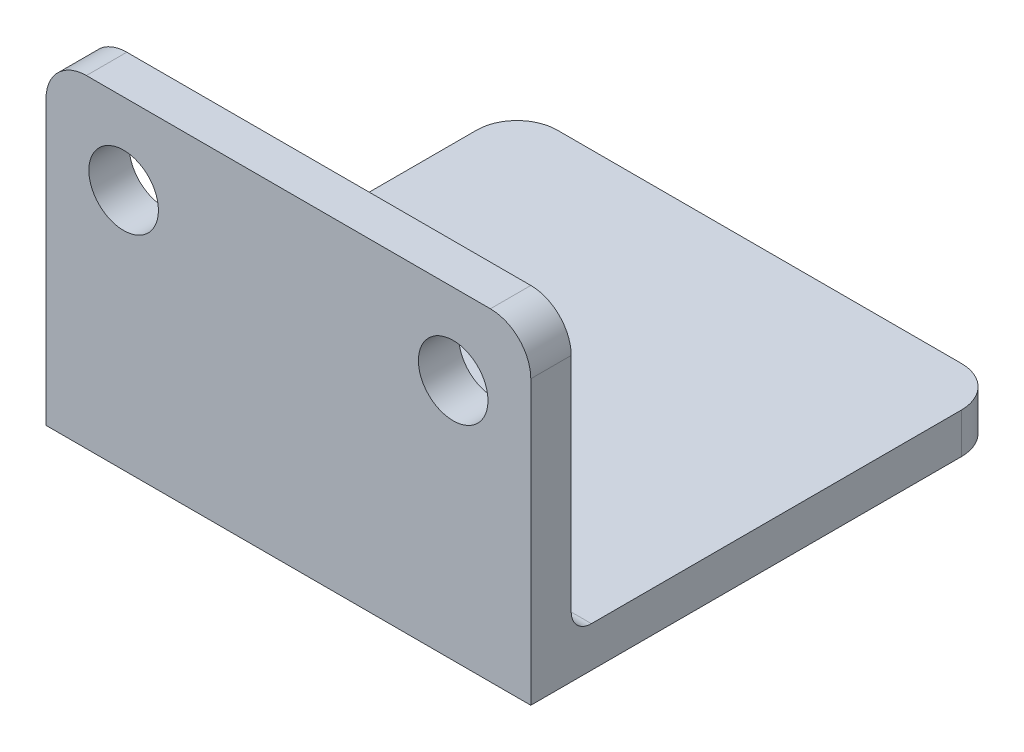
ISO-10303-21;
HEADER;
FILE_DESCRIPTION(('STEP AP214'),'2;1');
FILE_NAME('part.step','',(''),(''),'','','');
FILE_SCHEMA(('AUTOMOTIVE_DESIGN { 1 0 10303 214 1 1 1 1 }'));
ENDSEC;
DATA;
#1=APPLICATION_CONTEXT('core data for automotive mechanical design processes');
#2=APPLICATION_PROTOCOL_DEFINITION('international standard','automotive_design',2000,#1);
#3=PRODUCT_CONTEXT('',#1,'mechanical');
#4=PRODUCT('Part','Part','',(#3));
#5=PRODUCT_RELATED_PRODUCT_CATEGORY('part','',(#4));
#6=PRODUCT_DEFINITION_FORMATION('','',#4);
#7=PRODUCT_DEFINITION_CONTEXT('part definition',#1,'design');
#8=PRODUCT_DEFINITION('design','',#6,#7);
#9=PRODUCT_DEFINITION_SHAPE('','',#8);
#10=(LENGTH_UNIT() NAMED_UNIT(*) SI_UNIT(.MILLI.,.METRE.));
#11=(NAMED_UNIT(*) PLANE_ANGLE_UNIT() SI_UNIT($,.RADIAN.));
#12=(NAMED_UNIT(*) SI_UNIT($,.STERADIAN.) SOLID_ANGLE_UNIT());
#13=UNCERTAINTY_MEASURE_WITH_UNIT(LENGTH_MEASURE(1.E-05),#10,'distance_accuracy_value','');
#14=(GEOMETRIC_REPRESENTATION_CONTEXT(3) GLOBAL_UNCERTAINTY_ASSIGNED_CONTEXT((#13)) GLOBAL_UNIT_ASSIGNED_CONTEXT((#10,
#11,#12)) REPRESENTATION_CONTEXT('',''));
#15=CARTESIAN_POINT('',(0.,0.,0.));
#16=DIRECTION('',(0.,0.,1.));
#17=DIRECTION('',(1.,0.,0.));
#18=AXIS2_PLACEMENT_3D('',#15,#16,#17);
#19=CARTESIAN_POINT('',(76.2,0.,-6.35));
#20=DIRECTION('',(0.,0.,1.));
#21=DIRECTION('',(1.,0.,0.));
#22=AXIS2_PLACEMENT_3D('',#19,#20,#21);
#23=PLANE('',#22);
#24=CARTESIAN_POINT('',(63.9981454823114,38.1,-6.35000000000001));
#25=DIRECTION('',(0.,0.,1.));
#26=DIRECTION('',(1.,0.,0.));
#27=AXIS2_PLACEMENT_3D('',#24,#25,#26);
#28=CIRCLE('',#27,5.47023534939912);
#29=CARTESIAN_POINT('',(69.4683808317105,38.1,-6.35000000000002));
#30=VERTEX_POINT('',#29);
#31=EDGE_CURVE('E275',#30,#30,#28,.T.);
#32=ORIENTED_EDGE('',*,*,#31,.T.);
#33=EDGE_LOOP('',(#32));
#34=FACE_BOUND('',#33,.T.);
#35=CARTESIAN_POINT('',(12.2018545176886,38.1,-6.35000000000001));
#36=DIRECTION('',(0.,0.,1.));
#37=DIRECTION('',(1.,0.,0.));
#38=AXIS2_PLACEMENT_3D('',#35,#36,#37);
#39=CIRCLE('',#38,5.4702353493991);
#40=CARTESIAN_POINT('',(17.6720898670877,38.1,-6.35000000000002));
#41=VERTEX_POINT('',#40);
#42=EDGE_CURVE('E153',#41,#41,#39,.T.);
#43=ORIENTED_EDGE('',*,*,#42,.T.);
#44=EDGE_LOOP('',(#43));
#45=FACE_BOUND('',#44,.T.);
#46=DIRECTION('',(0.,1.,0.));
#47=VECTOR('',#46,1.);
#48=CARTESIAN_POINT('',(76.2,0.,-6.35));
#49=LINE('',#48,#47);
#50=CARTESIAN_POINT('',(76.2,9.525,-6.35));
#51=VERTEX_POINT('',#50);
#52=CARTESIAN_POINT('',(76.2,44.45,-6.35));
#53=VERTEX_POINT('',#52);
#54=EDGE_CURVE('E143',#51,#53,#49,.T.);
#55=ORIENTED_EDGE('',*,*,#54,.F.);
#56=DIRECTION('',(-1.,0.,0.));
#57=VECTOR('',#56,1.);
#58=CARTESIAN_POINT('',(0.,9.525,-6.35));
#59=LINE('',#58,#57);
#60=CARTESIAN_POINT('',(0.,9.525,-6.35));
#61=VERTEX_POINT('',#60);
#62=EDGE_CURVE('E201',#51,#61,#59,.T.);
#63=ORIENTED_EDGE('',*,*,#62,.T.);
#64=DIRECTION('',(0.,1.,0.));
#65=VECTOR('',#64,1.);
#66=CARTESIAN_POINT('',(0.,0.,-6.35));
#67=LINE('',#66,#65);
#68=CARTESIAN_POINT('',(0.,44.45,-6.35));
#69=VERTEX_POINT('',#68);
#70=EDGE_CURVE('E151',#61,#69,#67,.T.);
#71=ORIENTED_EDGE('',*,*,#70,.T.);
#72=CARTESIAN_POINT('',(6.35,44.45,-6.35));
#73=DIRECTION('',(0.,0.,1.));
#74=DIRECTION('',(1.,0.,0.));
#75=AXIS2_PLACEMENT_3D('',#72,#73,#74);
#76=CIRCLE('',#75,6.35);
#77=CARTESIAN_POINT('',(6.35000000000002,50.8,-6.35));
#78=VERTEX_POINT('',#77);
#79=EDGE_CURVE('E175',#69,#78,#76,.F.);
#80=ORIENTED_EDGE('',*,*,#79,.T.);
#81=DIRECTION('',(-1.,0.,0.));
#82=VECTOR('',#81,1.);
#83=CARTESIAN_POINT('',(76.2,50.8,-6.35));
#84=LINE('',#83,#82);
#85=CARTESIAN_POINT('',(69.85,50.8,-6.35));
#86=VERTEX_POINT('',#85);
#87=EDGE_CURVE('E163',#86,#78,#84,.T.);
#88=ORIENTED_EDGE('',*,*,#87,.F.);
#89=CARTESIAN_POINT('',(69.85,44.45,-6.35));
#90=DIRECTION('',(0.,0.,1.));
#91=DIRECTION('',(1.,0.,0.));
#92=AXIS2_PLACEMENT_3D('',#89,#90,#91);
#93=CIRCLE('',#92,6.35);
#94=EDGE_CURVE('E172',#86,#53,#93,.F.);
#95=ORIENTED_EDGE('',*,*,#94,.T.);
#96=EDGE_LOOP('',(#55,#63,#71,#80,#88,#95));
#97=FACE_BOUND('',#96,.T.);
#98=ADVANCED_FACE('F33',(#34,#45,#97),#23,.F.);
#99=CARTESIAN_POINT('',(76.2,50.8,0.));
#100=DIRECTION('',(0.,1.,0.));
#101=DIRECTION('',(0.,0.,1.));
#102=AXIS2_PLACEMENT_3D('',#99,#100,#101);
#103=PLANE('',#102);
#104=ORIENTED_EDGE('',*,*,#87,.T.);
#105=DIRECTION('',(0.,0.,-1.));
#106=VECTOR('',#105,1.);
#107=CARTESIAN_POINT('',(6.34999999999999,50.8,0.));
#108=LINE('',#107,#106);
#109=CARTESIAN_POINT('',(6.35000000000002,50.8,0.));
#110=VERTEX_POINT('',#109);
#111=EDGE_CURVE('E180',#78,#110,#108,.F.);
#112=ORIENTED_EDGE('',*,*,#111,.T.);
#113=DIRECTION('',(-1.,0.,0.));
#114=VECTOR('',#113,1.);
#115=CARTESIAN_POINT('',(76.2,50.8,0.));
#116=LINE('',#115,#114);
#117=CARTESIAN_POINT('',(69.85,50.8,0.));
#118=VERTEX_POINT('',#117);
#119=EDGE_CURVE('E137',#118,#110,#116,.T.);
#120=ORIENTED_EDGE('',*,*,#119,.F.);
#121=DIRECTION('',(0.,0.,-1.));
#122=VECTOR('',#121,1.);
#123=CARTESIAN_POINT('',(69.85,50.8,-6.35));
#124=LINE('',#123,#122);
#125=EDGE_CURVE('E177',#118,#86,#124,.T.);
#126=ORIENTED_EDGE('',*,*,#125,.T.);
#127=EDGE_LOOP('',(#104,#112,#120,#126));
#128=FACE_BOUND('',#127,.T.);
#129=ADVANCED_FACE('F218',(#128),#103,.T.);
#130=CARTESIAN_POINT('',(76.2,0.,0.));
#131=DIRECTION('',(0.,0.,1.));
#132=DIRECTION('',(1.,0.,0.));
#133=AXIS2_PLACEMENT_3D('',#130,#131,#132);
#134=PLANE('',#133);
#135=CARTESIAN_POINT('',(63.9981454823114,38.1,0.));
#136=DIRECTION('',(0.,0.,1.));
#137=DIRECTION('',(-1.,0.,0.));
#138=AXIS2_PLACEMENT_3D('',#135,#136,#137);
#139=CIRCLE('',#138,5.47023534939912);
#140=CARTESIAN_POINT('',(69.4683808317105,38.1,0.));
#141=VERTEX_POINT('',#140);
#142=EDGE_CURVE('E273',#141,#141,#139,.T.);
#143=ORIENTED_EDGE('',*,*,#142,.F.);
#144=EDGE_LOOP('',(#143));
#145=FACE_BOUND('',#144,.T.);
#146=CARTESIAN_POINT('',(12.2018545176886,38.1,0.));
#147=DIRECTION('',(0.,0.,1.));
#148=DIRECTION('',(1.,0.,0.));
#149=AXIS2_PLACEMENT_3D('',#146,#147,#148);
#150=CIRCLE('',#149,5.4702353493991);
#151=CARTESIAN_POINT('',(17.6720898670877,38.1,0.));
#152=VERTEX_POINT('',#151);
#153=EDGE_CURVE('E276',#152,#152,#150,.T.);
#154=ORIENTED_EDGE('',*,*,#153,.F.);
#155=EDGE_LOOP('',(#154));
#156=FACE_BOUND('',#155,.T.);
#157=ORIENTED_EDGE('',*,*,#119,.T.);
#158=CARTESIAN_POINT('',(6.35,44.45,0.));
#159=DIRECTION('',(0.,0.,1.));
#160=DIRECTION('',(1.,0.,0.));
#161=AXIS2_PLACEMENT_3D('',#158,#159,#160);
#162=CIRCLE('',#161,6.35);
#163=CARTESIAN_POINT('',(0.,44.45,0.));
#164=VERTEX_POINT('',#163);
#165=EDGE_CURVE('E184',#110,#164,#162,.T.);
#166=ORIENTED_EDGE('',*,*,#165,.T.);
#167=DIRECTION('',(0.,1.,0.));
#168=VECTOR('',#167,1.);
#169=CARTESIAN_POINT('',(0.,0.,0.));
#170=LINE('',#169,#168);
#171=CARTESIAN_POINT('',(0.,0.,0.));
#172=VERTEX_POINT('',#171);
#173=EDGE_CURVE('E136',#172,#164,#170,.T.);
#174=ORIENTED_EDGE('',*,*,#173,.F.);
#175=DIRECTION('',(-1.,0.,0.));
#176=VECTOR('',#175,1.);
#177=CARTESIAN_POINT('',(76.2,0.,0.));
#178=LINE('',#177,#176);
#179=CARTESIAN_POINT('',(76.2,0.,0.));
#180=VERTEX_POINT('',#179);
#181=EDGE_CURVE('E120',#180,#172,#178,.T.);
#182=ORIENTED_EDGE('',*,*,#181,.F.);
#183=DIRECTION('',(0.,1.,0.));
#184=VECTOR('',#183,1.);
#185=CARTESIAN_POINT('',(76.2,0.,0.));
#186=LINE('',#185,#184);
#187=CARTESIAN_POINT('',(76.2,44.45,0.));
#188=VERTEX_POINT('',#187);
#189=EDGE_CURVE('E128',#180,#188,#186,.T.);
#190=ORIENTED_EDGE('',*,*,#189,.T.);
#191=CARTESIAN_POINT('',(69.85,44.45,0.));
#192=DIRECTION('',(0.,0.,1.));
#193=DIRECTION('',(1.,0.,0.));
#194=AXIS2_PLACEMENT_3D('',#191,#192,#193);
#195=CIRCLE('',#194,6.35);
#196=EDGE_CURVE('E182',#188,#118,#195,.T.);
#197=ORIENTED_EDGE('',*,*,#196,.T.);
#198=EDGE_LOOP('',(#157,#166,#174,#182,#190,#197));
#199=FACE_BOUND('',#198,.T.);
#200=ADVANCED_FACE('F133',(#145,#156,#199),#134,.T.);
#201=CARTESIAN_POINT('',(76.2,0.,-74.0264919260767));
#202=DIRECTION('',(0.,-1.,0.));
#203=DIRECTION('',(0.,0.,-1.));
#204=AXIS2_PLACEMENT_3D('',#201,#202,#203);
#205=PLANE('',#204);
#206=DIRECTION('',(0.,0.,1.));
#207=VECTOR('',#206,1.);
#208=CARTESIAN_POINT('',(0.,0.,-74.0264919260767));
#209=LINE('',#208,#207);
#210=CARTESIAN_POINT('',(0.,0.,-67.6764919260767));
#211=VERTEX_POINT('',#210);
#212=EDGE_CURVE('E155',#211,#172,#209,.T.);
#213=ORIENTED_EDGE('',*,*,#212,.F.);
#214=CARTESIAN_POINT('',(6.35,0.,-67.6764919260767));
#215=DIRECTION('',(0.,-1.,0.));
#216=DIRECTION('',(0.,0.,-1.));
#217=AXIS2_PLACEMENT_3D('',#214,#215,#216);
#218=CIRCLE('',#217,6.35);
#219=CARTESIAN_POINT('',(6.35000000000002,0.,-74.0264919260767));
#220=VERTEX_POINT('',#219);
#221=EDGE_CURVE('E190',#211,#220,#218,.T.);
#222=ORIENTED_EDGE('',*,*,#221,.T.);
#223=DIRECTION('',(-1.,0.,0.));
#224=VECTOR('',#223,1.);
#225=CARTESIAN_POINT('',(76.2,0.,-74.0264919260767));
#226=LINE('',#225,#224);
#227=CARTESIAN_POINT('',(69.85,0.,-74.0264919260767));
#228=VERTEX_POINT('',#227);
#229=EDGE_CURVE('E138',#228,#220,#226,.T.);
#230=ORIENTED_EDGE('',*,*,#229,.F.);
#231=CARTESIAN_POINT('',(69.85,0.,-67.6764919260767));
#232=DIRECTION('',(0.,-1.,0.));
#233=DIRECTION('',(0.,0.,-1.));
#234=AXIS2_PLACEMENT_3D('',#231,#232,#233);
#235=CIRCLE('',#234,6.35);
#236=CARTESIAN_POINT('',(76.2,0.,-67.6764919260767));
#237=VERTEX_POINT('',#236);
#238=EDGE_CURVE('E123',#228,#237,#235,.T.);
#239=ORIENTED_EDGE('',*,*,#238,.T.);
#240=DIRECTION('',(0.,0.,1.));
#241=VECTOR('',#240,1.);
#242=CARTESIAN_POINT('',(76.2,0.,-74.0264919260767));
#243=LINE('',#242,#241);
#244=EDGE_CURVE('E116',#237,#180,#243,.T.);
#245=ORIENTED_EDGE('',*,*,#244,.T.);
#246=ORIENTED_EDGE('',*,*,#181,.T.);
#247=EDGE_LOOP('',(#213,#222,#230,#239,#245,#246));
#248=FACE_BOUND('',#247,.T.);
#249=ADVANCED_FACE('F119',(#248),#205,.T.);
#250=CARTESIAN_POINT('',(76.2,6.35,-74.0264919260767));
#251=DIRECTION('',(0.,0.,-1.));
#252=DIRECTION('',(-1.,0.,0.));
#253=AXIS2_PLACEMENT_3D('',#250,#251,#252);
#254=PLANE('',#253);
#255=ORIENTED_EDGE('',*,*,#229,.T.);
#256=DIRECTION('',(0.,-1.,0.));
#257=VECTOR('',#256,1.);
#258=CARTESIAN_POINT('',(6.34999999999999,6.35,-74.0264919260767));
#259=LINE('',#258,#257);
#260=CARTESIAN_POINT('',(6.35000000000002,6.35,-74.0264919260767));
#261=VERTEX_POINT('',#260);
#262=EDGE_CURVE('E195',#220,#261,#259,.F.);
#263=ORIENTED_EDGE('',*,*,#262,.T.);
#264=DIRECTION('',(-1.,0.,0.));
#265=VECTOR('',#264,1.);
#266=CARTESIAN_POINT('',(76.2,6.35,-74.0264919260767));
#267=LINE('',#266,#265);
#268=CARTESIAN_POINT('',(69.85,6.35,-74.0264919260767));
#269=VERTEX_POINT('',#268);
#270=EDGE_CURVE('E150',#269,#261,#267,.T.);
#271=ORIENTED_EDGE('',*,*,#270,.F.);
#272=DIRECTION('',(0.,-1.,0.));
#273=VECTOR('',#272,1.);
#274=CARTESIAN_POINT('',(69.85,0.,-74.0264919260767));
#275=LINE('',#274,#273);
#276=EDGE_CURVE('E192',#269,#228,#275,.T.);
#277=ORIENTED_EDGE('',*,*,#276,.T.);
#278=EDGE_LOOP('',(#255,#263,#271,#277));
#279=FACE_BOUND('',#278,.T.);
#280=ADVANCED_FACE('F249',(#279),#254,.T.);
#281=CARTESIAN_POINT('',(76.2,6.35,-74.0264919260767));
#282=DIRECTION('',(0.,-1.,0.));
#283=DIRECTION('',(0.,0.,-1.));
#284=AXIS2_PLACEMENT_3D('',#281,#282,#283);
#285=PLANE('',#284);
#286=DIRECTION('',(0.,0.,1.));
#287=VECTOR('',#286,1.);
#288=CARTESIAN_POINT('',(0.,6.35,-74.0264919260767));
#289=LINE('',#288,#287);
#290=CARTESIAN_POINT('',(0.,6.35,-67.6764919260767));
#291=VERTEX_POINT('',#290);
#292=CARTESIAN_POINT('',(0.,6.35,-9.52500000000001));
#293=VERTEX_POINT('',#292);
#294=EDGE_CURVE('E145',#291,#293,#289,.T.);
#295=ORIENTED_EDGE('',*,*,#294,.T.);
#296=DIRECTION('',(-1.,0.,0.));
#297=VECTOR('',#296,1.);
#298=CARTESIAN_POINT('',(76.2,6.35,-9.525));
#299=LINE('',#298,#297);
#300=CARTESIAN_POINT('',(76.2,6.35,-9.52500000000001));
#301=VERTEX_POINT('',#300);
#302=EDGE_CURVE('E48',#293,#301,#299,.F.);
#303=ORIENTED_EDGE('',*,*,#302,.T.);
#304=DIRECTION('',(0.,0.,1.));
#305=VECTOR('',#304,1.);
#306=CARTESIAN_POINT('',(76.2,6.35,-74.0264919260767));
#307=LINE('',#306,#305);
#308=CARTESIAN_POINT('',(76.2,6.35,-67.6764919260767));
#309=VERTEX_POINT('',#308);
#310=EDGE_CURVE('E127',#309,#301,#307,.T.);
#311=ORIENTED_EDGE('',*,*,#310,.F.);
#312=CARTESIAN_POINT('',(69.85,6.35,-67.6764919260767));
#313=DIRECTION('',(0.,-1.,0.));
#314=DIRECTION('',(0.,0.,-1.));
#315=AXIS2_PLACEMENT_3D('',#312,#313,#314);
#316=CIRCLE('',#315,6.35);
#317=EDGE_CURVE('E197',#309,#269,#316,.F.);
#318=ORIENTED_EDGE('',*,*,#317,.T.);
#319=ORIENTED_EDGE('',*,*,#270,.T.);
#320=CARTESIAN_POINT('',(6.35,6.34999999999999,-67.6764919260767));
#321=DIRECTION('',(0.,-1.,0.));
#322=DIRECTION('',(0.,0.,-1.));
#323=AXIS2_PLACEMENT_3D('',#320,#321,#322);
#324=CIRCLE('',#323,6.35);
#325=EDGE_CURVE('E199',#261,#291,#324,.F.);
#326=ORIENTED_EDGE('',*,*,#325,.T.);
#327=EDGE_LOOP('',(#295,#303,#311,#318,#319,#326));
#328=FACE_BOUND('',#327,.T.);
#329=ADVANCED_FACE('F252',(#328),#285,.F.);
#330=CARTESIAN_POINT('',(76.2,50.8,-6.35));
#331=DIRECTION('',(-1.,0.,0.));
#332=DIRECTION('',(0.,0.,1.));
#333=AXIS2_PLACEMENT_3D('',#330,#331,#332);
#334=PLANE('',#333);
#335=ORIENTED_EDGE('',*,*,#310,.T.);
#336=CARTESIAN_POINT('',(76.2,9.525,-9.525));
#337=DIRECTION('',(-1.,0.,0.));
#338=DIRECTION('',(0.,0.,1.));
#339=AXIS2_PLACEMENT_3D('',#336,#337,#338);
#340=CIRCLE('',#339,3.175);
#341=EDGE_CURVE('E11',#301,#51,#340,.T.);
#342=ORIENTED_EDGE('',*,*,#341,.T.);
#343=ORIENTED_EDGE('',*,*,#54,.T.);
#344=DIRECTION('',(0.,0.,-1.));
#345=VECTOR('',#344,1.);
#346=CARTESIAN_POINT('',(76.2,44.45,0.));
#347=LINE('',#346,#345);
#348=EDGE_CURVE('E142',#53,#188,#347,.F.);
#349=ORIENTED_EDGE('',*,*,#348,.T.);
#350=ORIENTED_EDGE('',*,*,#189,.F.);
#351=ORIENTED_EDGE('',*,*,#244,.F.);
#352=DIRECTION('',(0.,-1.,0.));
#353=VECTOR('',#352,1.);
#354=CARTESIAN_POINT('',(76.2,6.35,-67.6764919260767));
#355=LINE('',#354,#353);
#356=EDGE_CURVE('E186',#237,#309,#355,.F.);
#357=ORIENTED_EDGE('',*,*,#356,.T.);
#358=EDGE_LOOP('',(#335,#342,#343,#349,#350,#351,#357));
#359=FACE_BOUND('',#358,.T.);
#360=ADVANCED_FACE('F140',(#359),#334,.F.);
#361=CARTESIAN_POINT('',(0.,50.8,-6.35));
#362=DIRECTION('',(-1.,0.,0.));
#363=DIRECTION('',(0.,0.,1.));
#364=AXIS2_PLACEMENT_3D('',#361,#362,#363);
#365=PLANE('',#364);
#366=ORIENTED_EDGE('',*,*,#173,.T.);
#367=DIRECTION('',(0.,0.,-1.));
#368=VECTOR('',#367,1.);
#369=CARTESIAN_POINT('',(0.,44.45,-6.35));
#370=LINE('',#369,#368);
#371=EDGE_CURVE('E169',#164,#69,#370,.T.);
#372=ORIENTED_EDGE('',*,*,#371,.T.);
#373=ORIENTED_EDGE('',*,*,#70,.F.);
#374=CARTESIAN_POINT('',(0.,9.525,-9.525));
#375=DIRECTION('',(-1.,0.,0.));
#376=DIRECTION('',(0.,0.,1.));
#377=AXIS2_PLACEMENT_3D('',#374,#375,#376);
#378=CIRCLE('',#377,3.175);
#379=EDGE_CURVE('E41',#61,#293,#378,.F.);
#380=ORIENTED_EDGE('',*,*,#379,.T.);
#381=ORIENTED_EDGE('',*,*,#294,.F.);
#382=DIRECTION('',(0.,-1.,0.));
#383=VECTOR('',#382,1.);
#384=CARTESIAN_POINT('',(0.,50.8,-67.6764919260767));
#385=LINE('',#384,#383);
#386=EDGE_CURVE('E166',#291,#211,#385,.T.);
#387=ORIENTED_EDGE('',*,*,#386,.T.);
#388=ORIENTED_EDGE('',*,*,#212,.T.);
#389=EDGE_LOOP('',(#366,#372,#373,#380,#381,#387,#388));
#390=FACE_BOUND('',#389,.T.);
#391=ADVANCED_FACE('F210',(#390),#365,.T.);
#392=CARTESIAN_POINT('',(6.35,44.45,-6.35));
#393=DIRECTION('',(0.,0.,-1.));
#394=DIRECTION('',(-1.,0.,0.));
#395=AXIS2_PLACEMENT_3D('',#392,#393,#394);
#396=CYLINDRICAL_SURFACE('',#395,6.35);
#397=ORIENTED_EDGE('',*,*,#165,.F.);
#398=ORIENTED_EDGE('',*,*,#111,.F.);
#399=ORIENTED_EDGE('',*,*,#79,.F.);
#400=ORIENTED_EDGE('',*,*,#371,.F.);
#401=EDGE_LOOP('',(#397,#398,#399,#400));
#402=FACE_BOUND('',#401,.T.);
#403=ADVANCED_FACE('F214',(#402),#396,.T.);
#404=CARTESIAN_POINT('',(69.85,44.45,0.));
#405=DIRECTION('',(0.,0.,1.));
#406=DIRECTION('',(1.,0.,0.));
#407=AXIS2_PLACEMENT_3D('',#404,#405,#406);
#408=CYLINDRICAL_SURFACE('',#407,6.35);
#409=ORIENTED_EDGE('',*,*,#196,.F.);
#410=ORIENTED_EDGE('',*,*,#348,.F.);
#411=ORIENTED_EDGE('',*,*,#94,.F.);
#412=ORIENTED_EDGE('',*,*,#125,.F.);
#413=EDGE_LOOP('',(#409,#410,#411,#412));
#414=FACE_BOUND('',#413,.T.);
#415=ADVANCED_FACE('F222',(#414),#408,.T.);
#416=CARTESIAN_POINT('',(6.35,50.8,-67.6764919260767));
#417=DIRECTION('',(0.,-1.,0.));
#418=DIRECTION('',(0.,0.,-1.));
#419=AXIS2_PLACEMENT_3D('',#416,#417,#418);
#420=CYLINDRICAL_SURFACE('',#419,6.35);
#421=ORIENTED_EDGE('',*,*,#325,.F.);
#422=ORIENTED_EDGE('',*,*,#262,.F.);
#423=ORIENTED_EDGE('',*,*,#221,.F.);
#424=ORIENTED_EDGE('',*,*,#386,.F.);
#425=EDGE_LOOP('',(#421,#422,#423,#424));
#426=FACE_BOUND('',#425,.T.);
#427=ADVANCED_FACE('F224',(#426),#420,.T.);
#428=CARTESIAN_POINT('',(69.85,6.35,-67.6764919260767));
#429=DIRECTION('',(0.,1.,0.));
#430=DIRECTION('',(0.,0.,1.));
#431=AXIS2_PLACEMENT_3D('',#428,#429,#430);
#432=CYLINDRICAL_SURFACE('',#431,6.35);
#433=ORIENTED_EDGE('',*,*,#317,.F.);
#434=ORIENTED_EDGE('',*,*,#356,.F.);
#435=ORIENTED_EDGE('',*,*,#238,.F.);
#436=ORIENTED_EDGE('',*,*,#276,.F.);
#437=EDGE_LOOP('',(#433,#434,#435,#436));
#438=FACE_BOUND('',#437,.T.);
#439=ADVANCED_FACE('F230',(#438),#432,.T.);
#440=CARTESIAN_POINT('',(12.2018545176886,38.1,-76.2));
#441=DIRECTION('',(0.,0.,1.));
#442=DIRECTION('',(1.,0.,0.));
#443=AXIS2_PLACEMENT_3D('',#440,#441,#442);
#444=CYLINDRICAL_SURFACE('',#443,5.4702353493991);
#445=CARTESIAN_POINT('',(17.6720898670877,38.1,0.));
#446=CARTESIAN_POINT('',(17.6720898670877,38.1,-0.0661458333333318));
#447=CARTESIAN_POINT('',(17.6720898670877,38.1,-0.132291666666664));
#448=CARTESIAN_POINT('',(17.6720898670877,38.1,-0.264583333333332));
#449=CARTESIAN_POINT('',(17.6720898670877,38.1,-0.330729166666668));
#450=CARTESIAN_POINT('',(17.6720898670877,38.1,-0.463020833333337));
#451=CARTESIAN_POINT('',(17.6720898670877,38.1,-0.529166666666669));
#452=CARTESIAN_POINT('',(17.6720898670877,38.1,-0.661458333333337));
#453=CARTESIAN_POINT('',(17.6720898670877,38.1,-0.727604166666673));
#454=CARTESIAN_POINT('',(17.6720898670877,38.1,-0.859895833333342));
#455=CARTESIAN_POINT('',(17.6720898670877,38.1,-0.926041666666673));
#456=CARTESIAN_POINT('',(17.6720898670877,38.1,-1.05833333333334));
#457=CARTESIAN_POINT('',(17.6720898670877,38.1,-1.12447916666667));
#458=CARTESIAN_POINT('',(17.6720898670877,38.1,-1.25677083333334));
#459=CARTESIAN_POINT('',(17.6720898670877,38.1,-1.32291666666667));
#460=CARTESIAN_POINT('',(17.6720898670877,38.1,-1.45520833333334));
#461=CARTESIAN_POINT('',(17.6720898670877,38.1,-1.52135416666667));
#462=CARTESIAN_POINT('',(17.6720898670877,38.1,-1.65364583333334));
#463=CARTESIAN_POINT('',(17.6720898670877,38.1,-1.71979166666667));
#464=CARTESIAN_POINT('',(17.6720898670877,38.1,-1.85208333333334));
#465=CARTESIAN_POINT('',(17.6720898670877,38.1,-1.91822916666667));
#466=CARTESIAN_POINT('',(17.6720898670877,38.1,-2.05052083333334));
#467=CARTESIAN_POINT('',(17.6720898670877,38.1,-2.11666666666667));
#468=CARTESIAN_POINT('',(17.6720898670877,38.1,-2.24895833333334));
#469=CARTESIAN_POINT('',(17.6720898670877,38.1,-2.31510416666667));
#470=CARTESIAN_POINT('',(17.6720898670877,38.1,-2.44739583333334));
#471=CARTESIAN_POINT('',(17.6720898670877,38.1,-2.51354166666667));
#472=CARTESIAN_POINT('',(17.6720898670877,38.1,-2.64583333333334));
#473=CARTESIAN_POINT('',(17.6720898670877,38.1,-2.71197916666667));
#474=CARTESIAN_POINT('',(17.6720898670877,38.1,-2.84427083333334));
#475=CARTESIAN_POINT('',(17.6720898670877,38.1,-2.91041666666668));
#476=CARTESIAN_POINT('',(17.6720898670877,38.1,-3.04270833333335));
#477=CARTESIAN_POINT('',(17.6720898670877,38.1,-3.10885416666668));
#478=CARTESIAN_POINT('',(17.6720898670877,38.1,-3.24114583333334));
#479=CARTESIAN_POINT('',(17.6720898670877,38.1,-3.30729166666667));
#480=CARTESIAN_POINT('',(17.6720898670877,38.1,-3.43958333333334));
#481=CARTESIAN_POINT('',(17.6720898670877,38.1,-3.50572916666668));
#482=CARTESIAN_POINT('',(17.6720898670877,38.1,-3.63802083333335));
#483=CARTESIAN_POINT('',(17.6720898670877,38.1,-3.70416666666668));
#484=CARTESIAN_POINT('',(17.6720898670877,38.1,-3.83645833333335));
#485=CARTESIAN_POINT('',(17.6720898670877,38.1,-3.90260416666668));
#486=CARTESIAN_POINT('',(17.6720898670877,38.1,-4.03489583333335));
#487=CARTESIAN_POINT('',(17.6720898670877,38.1,-4.10104166666668));
#488=CARTESIAN_POINT('',(17.6720898670877,38.1,-4.23333333333335));
#489=CARTESIAN_POINT('',(17.6720898670877,38.1,-4.29947916666668));
#490=CARTESIAN_POINT('',(17.6720898670877,38.1,-4.43177083333335));
#491=CARTESIAN_POINT('',(17.6720898670877,38.1,-4.49791666666668));
#492=CARTESIAN_POINT('',(17.6720898670877,38.1,-4.63020833333335));
#493=CARTESIAN_POINT('',(17.6720898670877,38.1,-4.69635416666668));
#494=CARTESIAN_POINT('',(17.6720898670877,38.1,-4.82864583333335));
#495=CARTESIAN_POINT('',(17.6720898670877,38.1,-4.89479166666668));
#496=CARTESIAN_POINT('',(17.6720898670877,38.1,-5.02708333333335));
#497=CARTESIAN_POINT('',(17.6720898670877,38.1,-5.09322916666668));
#498=CARTESIAN_POINT('',(17.6720898670877,38.1,-5.22552083333335));
#499=CARTESIAN_POINT('',(17.6720898670877,38.1,-5.29166666666668));
#500=CARTESIAN_POINT('',(17.6720898670877,38.1,-5.42395833333335));
#501=CARTESIAN_POINT('',(17.6720898670877,38.1,-5.49010416666668));
#502=CARTESIAN_POINT('',(17.6720898670877,38.1,-5.62239583333335));
#503=CARTESIAN_POINT('',(17.6720898670877,38.1,-5.68854166666669));
#504=CARTESIAN_POINT('',(17.6720898670877,38.1,-5.82083333333335));
#505=CARTESIAN_POINT('',(17.6720898670877,38.1,-5.88697916666669));
#506=CARTESIAN_POINT('',(17.6720898670877,38.1,-6.01927083333335));
#507=CARTESIAN_POINT('',(17.6720898670877,38.1,-6.08541666666669));
#508=CARTESIAN_POINT('',(17.6720898670877,38.1,-6.21770833333336));
#509=CARTESIAN_POINT('',(17.6720898670877,38.1,-6.28385416666669));
#510=CARTESIAN_POINT('',(17.6720898670877,38.1,-6.35000000000002));
#511=B_SPLINE_CURVE_WITH_KNOTS('',3,(#445,#446,#447,#448,#449,#450,#451,#452,#453,#454,#455,
#456,#457,#458,#459,#460,#461,#462,#463,#464,#465,#466,#467,#468,#469,#470,#471,#472,#473,#474,
#475,#476,#477,#478,#479,#480,#481,#482,#483,#484,#485,#486,#487,#488,#489,#490,#491,#492,#493,
#494,#495,#496,#497,#498,#499,#500,#501,#502,#503,#504,#505,#506,#507,#508,#509,#510),
.UNSPECIFIED.,.F.,.F.,(4,2,2,2,2,2,2,2,2,2,2,2,2,2,2,2,2,2,2,2,2,2,2,2,2,2,2,2,2,2,2,2,4),(0.,
0.198437499999995,0.396875000000005,0.5953125,0.79375000000001,0.992187500000005,1.190625,
1.38906250000001,1.58750000000001,1.7859375,1.98437500000001,2.18281250000001,2.38125,
2.57968750000001,2.77812500000001,2.97656250000002,3.17500000000001,3.37343750000001,
3.57187500000002,3.77031250000001,3.96875000000002,4.16718750000002,4.36562500000001,
4.56406250000002,4.76250000000002,4.96093750000001,5.15937500000002,5.35781250000002,
5.55625000000001,5.75468750000002,5.95312500000002,6.15156250000003,6.35000000000002),.UNSPECIFIED.);
#512=EDGE_CURVE('BSEAM260',#152,#41,#511,.T.);
#513=ORIENTED_EDGE('',*,*,#153,.T.);
#514=ORIENTED_EDGE('',*,*,#42,.F.);
#515=ORIENTED_EDGE('',*,*,#512,.T.);
#516=ORIENTED_EDGE('',*,*,#512,.F.);
#517=EDGE_LOOP('',(#513,#515,#514,#516));
#518=FACE_BOUND('',#517,.T.);
#519=ADVANCED_FACE('F260',(#518),#444,.F.);
#520=CARTESIAN_POINT('',(63.9981454823114,38.1,-76.2));
#521=DIRECTION('',(0.,0.,1.));
#522=DIRECTION('',(1.,0.,0.));
#523=AXIS2_PLACEMENT_3D('',#520,#521,#522);
#524=CYLINDRICAL_SURFACE('',#523,5.47023534939912);
#525=CARTESIAN_POINT('',(69.4683808317105,38.1,0.));
#526=CARTESIAN_POINT('',(69.4683808317105,38.1,-0.0661458333333318));
#527=CARTESIAN_POINT('',(69.4683808317105,38.1,-0.132291666666664));
#528=CARTESIAN_POINT('',(69.4683808317105,38.1,-0.264583333333332));
#529=CARTESIAN_POINT('',(69.4683808317105,38.1,-0.330729166666668));
#530=CARTESIAN_POINT('',(69.4683808317105,38.1,-0.463020833333337));
#531=CARTESIAN_POINT('',(69.4683808317105,38.1,-0.529166666666669));
#532=CARTESIAN_POINT('',(69.4683808317105,38.1,-0.661458333333337));
#533=CARTESIAN_POINT('',(69.4683808317105,38.1,-0.727604166666673));
#534=CARTESIAN_POINT('',(69.4683808317105,38.1,-0.859895833333342));
#535=CARTESIAN_POINT('',(69.4683808317105,38.1,-0.926041666666673));
#536=CARTESIAN_POINT('',(69.4683808317105,38.1,-1.05833333333334));
#537=CARTESIAN_POINT('',(69.4683808317105,38.1,-1.12447916666667));
#538=CARTESIAN_POINT('',(69.4683808317105,38.1,-1.25677083333334));
#539=CARTESIAN_POINT('',(69.4683808317105,38.1,-1.32291666666667));
#540=CARTESIAN_POINT('',(69.4683808317105,38.1,-1.45520833333334));
#541=CARTESIAN_POINT('',(69.4683808317105,38.1,-1.52135416666667));
#542=CARTESIAN_POINT('',(69.4683808317105,38.1,-1.65364583333334));
#543=CARTESIAN_POINT('',(69.4683808317105,38.1,-1.71979166666667));
#544=CARTESIAN_POINT('',(69.4683808317105,38.1,-1.85208333333334));
#545=CARTESIAN_POINT('',(69.4683808317105,38.1,-1.91822916666667));
#546=CARTESIAN_POINT('',(69.4683808317105,38.1,-2.05052083333334));
#547=CARTESIAN_POINT('',(69.4683808317105,38.1,-2.11666666666667));
#548=CARTESIAN_POINT('',(69.4683808317105,38.1,-2.24895833333334));
#549=CARTESIAN_POINT('',(69.4683808317105,38.1,-2.31510416666667));
#550=CARTESIAN_POINT('',(69.4683808317105,38.1,-2.44739583333334));
#551=CARTESIAN_POINT('',(69.4683808317105,38.1,-2.51354166666667));
#552=CARTESIAN_POINT('',(69.4683808317105,38.1,-2.64583333333334));
#553=CARTESIAN_POINT('',(69.4683808317105,38.1,-2.71197916666667));
#554=CARTESIAN_POINT('',(69.4683808317105,38.1,-2.84427083333334));
#555=CARTESIAN_POINT('',(69.4683808317105,38.1,-2.91041666666668));
#556=CARTESIAN_POINT('',(69.4683808317105,38.1,-3.04270833333335));
#557=CARTESIAN_POINT('',(69.4683808317105,38.1,-3.10885416666668));
#558=CARTESIAN_POINT('',(69.4683808317105,38.1,-3.24114583333334));
#559=CARTESIAN_POINT('',(69.4683808317105,38.1,-3.30729166666667));
#560=CARTESIAN_POINT('',(69.4683808317105,38.1,-3.43958333333334));
#561=CARTESIAN_POINT('',(69.4683808317105,38.1,-3.50572916666668));
#562=CARTESIAN_POINT('',(69.4683808317105,38.1,-3.63802083333335));
#563=CARTESIAN_POINT('',(69.4683808317105,38.1,-3.70416666666668));
#564=CARTESIAN_POINT('',(69.4683808317105,38.1,-3.83645833333335));
#565=CARTESIAN_POINT('',(69.4683808317105,38.1,-3.90260416666668));
#566=CARTESIAN_POINT('',(69.4683808317105,38.1,-4.03489583333335));
#567=CARTESIAN_POINT('',(69.4683808317105,38.1,-4.10104166666668));
#568=CARTESIAN_POINT('',(69.4683808317105,38.1,-4.23333333333335));
#569=CARTESIAN_POINT('',(69.4683808317105,38.1,-4.29947916666668));
#570=CARTESIAN_POINT('',(69.4683808317105,38.1,-4.43177083333335));
#571=CARTESIAN_POINT('',(69.4683808317105,38.1,-4.49791666666668));
#572=CARTESIAN_POINT('',(69.4683808317105,38.1,-4.63020833333335));
#573=CARTESIAN_POINT('',(69.4683808317105,38.1,-4.69635416666668));
#574=CARTESIAN_POINT('',(69.4683808317105,38.1,-4.82864583333335));
#575=CARTESIAN_POINT('',(69.4683808317105,38.1,-4.89479166666668));
#576=CARTESIAN_POINT('',(69.4683808317105,38.1,-5.02708333333335));
#577=CARTESIAN_POINT('',(69.4683808317105,38.1,-5.09322916666668));
#578=CARTESIAN_POINT('',(69.4683808317105,38.1,-5.22552083333335));
#579=CARTESIAN_POINT('',(69.4683808317105,38.1,-5.29166666666668));
#580=CARTESIAN_POINT('',(69.4683808317105,38.1,-5.42395833333335));
#581=CARTESIAN_POINT('',(69.4683808317105,38.1,-5.49010416666668));
#582=CARTESIAN_POINT('',(69.4683808317105,38.1,-5.62239583333335));
#583=CARTESIAN_POINT('',(69.4683808317105,38.1,-5.68854166666669));
#584=CARTESIAN_POINT('',(69.4683808317105,38.1,-5.82083333333335));
#585=CARTESIAN_POINT('',(69.4683808317105,38.1,-5.88697916666669));
#586=CARTESIAN_POINT('',(69.4683808317105,38.1,-6.01927083333335));
#587=CARTESIAN_POINT('',(69.4683808317105,38.1,-6.08541666666669));
#588=CARTESIAN_POINT('',(69.4683808317105,38.1,-6.21770833333336));
#589=CARTESIAN_POINT('',(69.4683808317105,38.1,-6.28385416666669));
#590=CARTESIAN_POINT('',(69.4683808317105,38.1,-6.35000000000002));
#591=B_SPLINE_CURVE_WITH_KNOTS('',3,(#525,#526,#527,#528,#529,#530,#531,#532,#533,#534,#535,
#536,#537,#538,#539,#540,#541,#542,#543,#544,#545,#546,#547,#548,#549,#550,#551,#552,#553,#554,
#555,#556,#557,#558,#559,#560,#561,#562,#563,#564,#565,#566,#567,#568,#569,#570,#571,#572,#573,
#574,#575,#576,#577,#578,#579,#580,#581,#582,#583,#584,#585,#586,#587,#588,#589,#590),
.UNSPECIFIED.,.F.,.F.,(4,2,2,2,2,2,2,2,2,2,2,2,2,2,2,2,2,2,2,2,2,2,2,2,2,2,2,2,2,2,2,2,4),(0.,
0.198437499999995,0.396875000000005,0.5953125,0.79375000000001,0.992187500000005,1.190625,
1.38906250000001,1.58750000000001,1.7859375,1.98437500000001,2.18281250000001,2.38125,
2.57968750000001,2.77812500000001,2.97656250000002,3.17500000000001,3.37343750000001,
3.57187500000002,3.77031250000001,3.96875000000002,4.16718750000002,4.36562500000001,
4.56406250000002,4.76250000000002,4.96093750000001,5.15937500000002,5.35781250000002,
5.55625000000001,5.75468750000002,5.95312500000002,6.15156250000003,6.35000000000002),.UNSPECIFIED.);
#592=EDGE_CURVE('BSEAM263',#141,#30,#591,.T.);
#593=ORIENTED_EDGE('',*,*,#142,.T.);
#594=ORIENTED_EDGE('',*,*,#31,.F.);
#595=ORIENTED_EDGE('',*,*,#592,.T.);
#596=ORIENTED_EDGE('',*,*,#592,.F.);
#597=EDGE_LOOP('',(#593,#595,#594,#596));
#598=FACE_BOUND('',#597,.T.);
#599=ADVANCED_FACE('F263',(#598),#524,.F.);
#600=CARTESIAN_POINT('',(76.2,9.525,-9.525));
#601=DIRECTION('',(1.,0.,0.));
#602=DIRECTION('',(0.,0.,-1.));
#603=AXIS2_PLACEMENT_3D('',#600,#601,#602);
#604=CYLINDRICAL_SURFACE('',#603,3.175);
#605=ORIENTED_EDGE('',*,*,#341,.F.);
#606=ORIENTED_EDGE('',*,*,#302,.F.);
#607=ORIENTED_EDGE('',*,*,#379,.F.);
#608=ORIENTED_EDGE('',*,*,#62,.F.);
#609=EDGE_LOOP('',(#605,#606,#607,#608));
#610=FACE_BOUND('',#609,.T.);
#611=ADVANCED_FACE('F35',(#610),#604,.F.);
#612=CLOSED_SHELL('',(#98,#129,#200,#249,#280,#329,#360,#391,#403,#415,#427,#439,#519,#599,#611));
#613=MANIFOLD_SOLID_BREP('B2',#612);
#614=ADVANCED_BREP_SHAPE_REPRESENTATION('',(#18,#613),#14);
#615=SHAPE_DEFINITION_REPRESENTATION(#9,#614);
ENDSEC;
END-ISO-10303-21;
